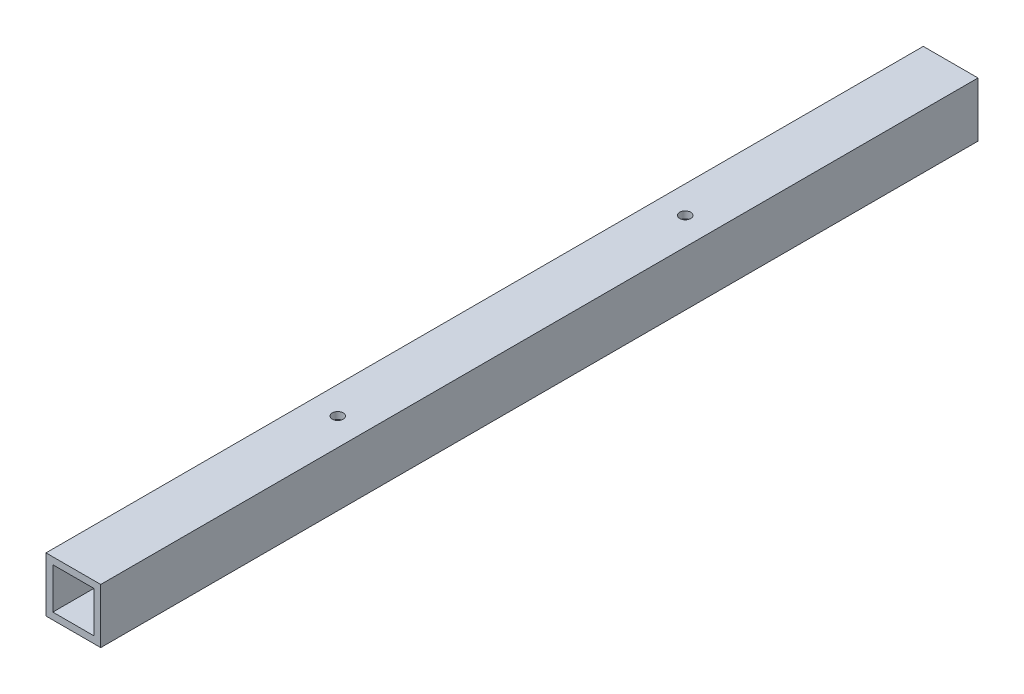
ISO-10303-21;
HEADER;
FILE_DESCRIPTION(('STEP AP214'),'2;1');
FILE_NAME('part.step','',(''),(''),'','','');
FILE_SCHEMA(('AUTOMOTIVE_DESIGN { 1 0 10303 214 1 1 1 1 }'));
ENDSEC;
DATA;
#1=APPLICATION_CONTEXT('core data for automotive mechanical design processes');
#2=APPLICATION_PROTOCOL_DEFINITION('international standard','automotive_design',2000,#1);
#3=PRODUCT_CONTEXT('',#1,'mechanical');
#4=PRODUCT('Part','Part','',(#3));
#5=PRODUCT_RELATED_PRODUCT_CATEGORY('part','',(#4));
#6=PRODUCT_DEFINITION_FORMATION('','',#4);
#7=PRODUCT_DEFINITION_CONTEXT('part definition',#1,'design');
#8=PRODUCT_DEFINITION('design','',#6,#7);
#9=PRODUCT_DEFINITION_SHAPE('','',#8);
#10=(LENGTH_UNIT() NAMED_UNIT(*) SI_UNIT(.MILLI.,.METRE.));
#11=(NAMED_UNIT(*) PLANE_ANGLE_UNIT() SI_UNIT($,.RADIAN.));
#12=(NAMED_UNIT(*) SI_UNIT($,.STERADIAN.) SOLID_ANGLE_UNIT());
#13=UNCERTAINTY_MEASURE_WITH_UNIT(LENGTH_MEASURE(1.E-05),#10,'distance_accuracy_value','');
#14=(GEOMETRIC_REPRESENTATION_CONTEXT(3) GLOBAL_UNCERTAINTY_ASSIGNED_CONTEXT((#13)) GLOBAL_UNIT_ASSIGNED_CONTEXT((#10,
#11,#12)) REPRESENTATION_CONTEXT('',''));
#15=CARTESIAN_POINT('',(0.,0.,0.));
#16=DIRECTION('',(0.,0.,1.));
#17=DIRECTION('',(1.,0.,0.));
#18=AXIS2_PLACEMENT_3D('',#15,#16,#17);
#19=CARTESIAN_POINT('',(-12.7,-12.7,407.19375));
#20=DIRECTION('',(0.,1.,0.));
#21=DIRECTION('',(0.,0.,1.));
#22=AXIS2_PLACEMENT_3D('',#19,#20,#21);
#23=PLANE('',#22);
#24=CARTESIAN_POINT('',(1.44190215323192E-10,-12.7,284.479999999999));
#25=DIRECTION('',(0.,1.,0.));
#26=DIRECTION('',(0.,0.,1.));
#27=AXIS2_PLACEMENT_3D('',#24,#25,#26);
#28=CIRCLE('',#27,7.62000000000002);
#29=CARTESIAN_POINT('',(1.44190215323192E-10,-12.7,276.859999999999));
#30=VERTEX_POINT('',#29);
#31=EDGE_CURVE('E249',#30,#30,#28,.T.);
#32=ORIENTED_EDGE('',*,*,#31,.T.);
#33=EDGE_LOOP('',(#32));
#34=FACE_BOUND('',#33,.T.);
#35=DIRECTION('',(1.,0.,0.));
#36=VECTOR('',#35,1.);
#37=CARTESIAN_POINT('',(-12.7,-12.7,0.));
#38=LINE('',#37,#36);
#39=CARTESIAN_POINT('',(-12.7,-12.7,0.));
#40=VERTEX_POINT('',#39);
#41=CARTESIAN_POINT('',(12.7,-12.7,0.));
#42=VERTEX_POINT('',#41);
#43=EDGE_CURVE('E145',#40,#42,#38,.T.);
#44=ORIENTED_EDGE('',*,*,#43,.T.);
#45=DIRECTION('',(0.,0.,-1.));
#46=VECTOR('',#45,1.);
#47=CARTESIAN_POINT('',(12.7,-12.7,407.19375));
#48=LINE('',#47,#46);
#49=CARTESIAN_POINT('',(12.7,-12.7,407.19375));
#50=VERTEX_POINT('',#49);
#51=EDGE_CURVE('E151',#50,#42,#48,.T.);
#52=ORIENTED_EDGE('',*,*,#51,.F.);
#53=DIRECTION('',(1.,0.,0.));
#54=VECTOR('',#53,1.);
#55=CARTESIAN_POINT('',(-12.7,-12.7,407.19375));
#56=LINE('',#55,#54);
#57=CARTESIAN_POINT('',(-12.7,-12.7,407.19375));
#58=VERTEX_POINT('',#57);
#59=EDGE_CURVE('E149',#58,#50,#56,.T.);
#60=ORIENTED_EDGE('',*,*,#59,.F.);
#61=DIRECTION('',(0.,0.,-1.));
#62=VECTOR('',#61,1.);
#63=CARTESIAN_POINT('',(-12.7,-12.7,407.19375));
#64=LINE('',#63,#62);
#65=EDGE_CURVE('E161',#58,#40,#64,.T.);
#66=ORIENTED_EDGE('',*,*,#65,.T.);
#67=EDGE_LOOP('',(#44,#52,#60,#66));
#68=FACE_BOUND('',#67,.T.);
#69=CARTESIAN_POINT('',(1.40221168010157E-10,-12.7,123.189999999998));
#70=DIRECTION('',(0.,1.,0.));
#71=DIRECTION('',(0.,0.,1.));
#72=AXIS2_PLACEMENT_3D('',#69,#70,#71);
#73=CIRCLE('',#72,7.62);
#74=CARTESIAN_POINT('',(1.40221168010157E-10,-12.7,115.569999999998));
#75=VERTEX_POINT('',#74);
#76=EDGE_CURVE('E243',#75,#75,#73,.T.);
#77=ORIENTED_EDGE('',*,*,#76,.T.);
#78=EDGE_LOOP('',(#77));
#79=FACE_BOUND('',#78,.T.);
#80=ADVANCED_FACE('F37',(#34,#68,#79),#23,.F.);
#81=CARTESIAN_POINT('',(-9.52500000000001,-9.52500000000001,407.19375));
#82=DIRECTION('',(0.,1.,0.));
#83=DIRECTION('',(0.,0.,1.));
#84=AXIS2_PLACEMENT_3D('',#81,#82,#83);
#85=PLANE('',#84);
#86=CARTESIAN_POINT('',(1.44190215323192E-10,-9.525,284.479999999999));
#87=DIRECTION('',(0.,1.,0.));
#88=DIRECTION('',(0.,0.,1.));
#89=AXIS2_PLACEMENT_3D('',#86,#87,#88);
#90=CIRCLE('',#89,7.62000000000002);
#91=CARTESIAN_POINT('',(1.44190215323192E-10,-9.52500000000001,276.859999999999));
#92=VERTEX_POINT('',#91);
#93=EDGE_CURVE('E244',#92,#92,#90,.T.);
#94=ORIENTED_EDGE('',*,*,#93,.F.);
#95=EDGE_LOOP('',(#94));
#96=FACE_BOUND('',#95,.T.);
#97=DIRECTION('',(1.,0.,0.));
#98=VECTOR('',#97,1.);
#99=CARTESIAN_POINT('',(-9.52500000000001,-9.52500000000001,0.));
#100=LINE('',#99,#98);
#101=CARTESIAN_POINT('',(-9.52500000000001,-9.52500000000001,0.));
#102=VERTEX_POINT('',#101);
#103=CARTESIAN_POINT('',(9.525,-9.52500000000001,0.));
#104=VERTEX_POINT('',#103);
#105=EDGE_CURVE('E111',#102,#104,#100,.T.);
#106=ORIENTED_EDGE('',*,*,#105,.F.);
#107=DIRECTION('',(0.,0.,-1.));
#108=VECTOR('',#107,1.);
#109=CARTESIAN_POINT('',(-9.52500000000001,-9.52500000000001,407.19375));
#110=LINE('',#109,#108);
#111=CARTESIAN_POINT('',(-9.52500000000001,-9.52500000000001,407.19375));
#112=VERTEX_POINT('',#111);
#113=EDGE_CURVE('E52',#112,#102,#110,.T.);
#114=ORIENTED_EDGE('',*,*,#113,.F.);
#115=DIRECTION('',(1.,0.,0.));
#116=VECTOR('',#115,1.);
#117=CARTESIAN_POINT('',(-9.52500000000001,-9.52500000000001,407.19375));
#118=LINE('',#117,#116);
#119=CARTESIAN_POINT('',(9.525,-9.52500000000001,407.19375));
#120=VERTEX_POINT('',#119);
#121=EDGE_CURVE('E125',#112,#120,#118,.T.);
#122=ORIENTED_EDGE('',*,*,#121,.T.);
#123=DIRECTION('',(0.,0.,-1.));
#124=VECTOR('',#123,1.);
#125=CARTESIAN_POINT('',(9.525,-9.52500000000001,407.19375));
#126=LINE('',#125,#124);
#127=EDGE_CURVE('E106',#120,#104,#126,.T.);
#128=ORIENTED_EDGE('',*,*,#127,.T.);
#129=EDGE_LOOP('',(#106,#114,#122,#128));
#130=FACE_BOUND('',#129,.T.);
#131=CARTESIAN_POINT('',(1.40221168010157E-10,-9.525,123.189999999998));
#132=DIRECTION('',(0.,1.,0.));
#133=DIRECTION('',(0.,0.,1.));
#134=AXIS2_PLACEMENT_3D('',#131,#132,#133);
#135=CIRCLE('',#134,7.62);
#136=CARTESIAN_POINT('',(1.40221168010157E-10,-9.52500000000001,115.569999999998));
#137=VERTEX_POINT('',#136);
#138=EDGE_CURVE('E240',#137,#137,#135,.T.);
#139=ORIENTED_EDGE('',*,*,#138,.F.);
#140=EDGE_LOOP('',(#139));
#141=FACE_BOUND('',#140,.T.);
#142=ADVANCED_FACE('F197',(#96,#130,#141),#85,.T.);
#143=CARTESIAN_POINT('',(0.,0.,407.19375));
#144=DIRECTION('',(0.,0.,1.));
#145=DIRECTION('',(1.,0.,0.));
#146=AXIS2_PLACEMENT_3D('',#143,#144,#145);
#147=PLANE('',#146);
#148=DIRECTION('',(0.,1.,0.));
#149=VECTOR('',#148,1.);
#150=CARTESIAN_POINT('',(12.7,12.7,407.19375));
#151=LINE('',#150,#149);
#152=CARTESIAN_POINT('',(12.7,12.7,407.19375));
#153=VERTEX_POINT('',#152);
#154=EDGE_CURVE('E141',#50,#153,#151,.T.);
#155=ORIENTED_EDGE('',*,*,#154,.T.);
#156=DIRECTION('',(-1.,0.,0.));
#157=VECTOR('',#156,1.);
#158=CARTESIAN_POINT('',(-12.7,12.7,407.19375));
#159=LINE('',#158,#157);
#160=CARTESIAN_POINT('',(-12.7,12.7,407.19375));
#161=VERTEX_POINT('',#160);
#162=EDGE_CURVE('E144',#153,#161,#159,.T.);
#163=ORIENTED_EDGE('',*,*,#162,.T.);
#164=DIRECTION('',(0.,-1.,0.));
#165=VECTOR('',#164,1.);
#166=CARTESIAN_POINT('',(-12.7,12.7,407.19375));
#167=LINE('',#166,#165);
#168=EDGE_CURVE('E147',#161,#58,#167,.T.);
#169=ORIENTED_EDGE('',*,*,#168,.T.);
#170=ORIENTED_EDGE('',*,*,#59,.T.);
#171=EDGE_LOOP('',(#155,#163,#169,#170));
#172=FACE_BOUND('',#171,.T.);
#173=DIRECTION('',(-1.,0.,0.));
#174=VECTOR('',#173,1.);
#175=CARTESIAN_POINT('',(-9.52500000000001,9.525,407.19375));
#176=LINE('',#175,#174);
#177=CARTESIAN_POINT('',(9.525,9.525,407.19375));
#178=VERTEX_POINT('',#177);
#179=CARTESIAN_POINT('',(-9.52500000000001,9.525,407.19375));
#180=VERTEX_POINT('',#179);
#181=EDGE_CURVE('E110',#178,#180,#176,.T.);
#182=ORIENTED_EDGE('',*,*,#181,.F.);
#183=DIRECTION('',(0.,1.,0.));
#184=VECTOR('',#183,1.);
#185=CARTESIAN_POINT('',(9.525,9.525,407.19375));
#186=LINE('',#185,#184);
#187=EDGE_CURVE('E102',#120,#178,#186,.T.);
#188=ORIENTED_EDGE('',*,*,#187,.F.);
#189=ORIENTED_EDGE('',*,*,#121,.F.);
#190=DIRECTION('',(0.,-1.,0.));
#191=VECTOR('',#190,1.);
#192=CARTESIAN_POINT('',(-9.52500000000001,9.525,407.19375));
#193=LINE('',#192,#191);
#194=EDGE_CURVE('E123',#180,#112,#193,.T.);
#195=ORIENTED_EDGE('',*,*,#194,.F.);
#196=EDGE_LOOP('',(#182,#188,#189,#195));
#197=FACE_BOUND('',#196,.T.);
#198=ADVANCED_FACE('F122',(#172,#197),#147,.T.);
#199=CARTESIAN_POINT('',(0.,0.,0.));
#200=DIRECTION('',(0.,0.,1.));
#201=DIRECTION('',(1.,0.,0.));
#202=AXIS2_PLACEMENT_3D('',#199,#200,#201);
#203=PLANE('',#202);
#204=DIRECTION('',(0.,1.,0.));
#205=VECTOR('',#204,1.);
#206=CARTESIAN_POINT('',(12.7,12.7,0.));
#207=LINE('',#206,#205);
#208=CARTESIAN_POINT('',(12.7,12.7,0.));
#209=VERTEX_POINT('',#208);
#210=EDGE_CURVE('E118',#42,#209,#207,.T.);
#211=ORIENTED_EDGE('',*,*,#210,.F.);
#212=ORIENTED_EDGE('',*,*,#43,.F.);
#213=DIRECTION('',(0.,-1.,0.));
#214=VECTOR('',#213,1.);
#215=CARTESIAN_POINT('',(-12.7,12.7,0.));
#216=LINE('',#215,#214);
#217=CARTESIAN_POINT('',(-12.7,12.7,0.));
#218=VERTEX_POINT('',#217);
#219=EDGE_CURVE('E156',#218,#40,#216,.T.);
#220=ORIENTED_EDGE('',*,*,#219,.F.);
#221=DIRECTION('',(-1.,0.,0.));
#222=VECTOR('',#221,1.);
#223=CARTESIAN_POINT('',(-12.7,12.7,0.));
#224=LINE('',#223,#222);
#225=EDGE_CURVE('E154',#209,#218,#224,.T.);
#226=ORIENTED_EDGE('',*,*,#225,.F.);
#227=EDGE_LOOP('',(#211,#212,#220,#226));
#228=FACE_BOUND('',#227,.T.);
#229=DIRECTION('',(0.,1.,0.));
#230=VECTOR('',#229,1.);
#231=CARTESIAN_POINT('',(9.525,9.525,0.));
#232=LINE('',#231,#230);
#233=CARTESIAN_POINT('',(9.525,9.525,0.));
#234=VERTEX_POINT('',#233);
#235=EDGE_CURVE('E60',#104,#234,#232,.T.);
#236=ORIENTED_EDGE('',*,*,#235,.T.);
#237=DIRECTION('',(-1.,0.,0.));
#238=VECTOR('',#237,1.);
#239=CARTESIAN_POINT('',(-9.52500000000001,9.525,0.));
#240=LINE('',#239,#238);
#241=CARTESIAN_POINT('',(-9.52500000000001,9.525,0.));
#242=VERTEX_POINT('',#241);
#243=EDGE_CURVE('E117',#234,#242,#240,.T.);
#244=ORIENTED_EDGE('',*,*,#243,.T.);
#245=DIRECTION('',(0.,-1.,0.));
#246=VECTOR('',#245,1.);
#247=CARTESIAN_POINT('',(-9.52500000000001,9.525,0.));
#248=LINE('',#247,#246);
#249=EDGE_CURVE('E133',#242,#102,#248,.T.);
#250=ORIENTED_EDGE('',*,*,#249,.T.);
#251=ORIENTED_EDGE('',*,*,#105,.T.);
#252=EDGE_LOOP('',(#236,#244,#250,#251));
#253=FACE_BOUND('',#252,.T.);
#254=ADVANCED_FACE('F174',(#228,#253),#203,.F.);
#255=CARTESIAN_POINT('',(12.7,12.7,407.19375));
#256=DIRECTION('',(-1.,0.,0.));
#257=DIRECTION('',(0.,-1.,0.));
#258=AXIS2_PLACEMENT_3D('',#255,#256,#257);
#259=PLANE('',#258);
#260=ORIENTED_EDGE('',*,*,#210,.T.);
#261=DIRECTION('',(0.,0.,-1.));
#262=VECTOR('',#261,1.);
#263=CARTESIAN_POINT('',(12.7,12.7,407.19375));
#264=LINE('',#263,#262);
#265=EDGE_CURVE('E11',#153,#209,#264,.T.);
#266=ORIENTED_EDGE('',*,*,#265,.F.);
#267=ORIENTED_EDGE('',*,*,#154,.F.);
#268=ORIENTED_EDGE('',*,*,#51,.T.);
#269=EDGE_LOOP('',(#260,#266,#267,#268));
#270=FACE_BOUND('',#269,.T.);
#271=ADVANCED_FACE('F39',(#270),#259,.F.);
#272=CARTESIAN_POINT('',(-12.7,12.7,407.19375));
#273=DIRECTION('',(0.,-1.,0.));
#274=DIRECTION('',(1.,0.,0.));
#275=AXIS2_PLACEMENT_3D('',#272,#273,#274);
#276=PLANE('',#275);
#277=CARTESIAN_POINT('',(1.40221168010157E-10,12.699999999994,123.189999999998));
#278=DIRECTION('',(0.,1.,0.));
#279=DIRECTION('',(0.,0.,1.));
#280=AXIS2_PLACEMENT_3D('',#277,#278,#279);
#281=CIRCLE('',#280,2.55269999999999);
#282=CARTESIAN_POINT('',(1.40221168010157E-10,12.699999999994,125.742699999998));
#283=VERTEX_POINT('',#282);
#284=EDGE_CURVE('E246',#283,#283,#281,.T.);
#285=ORIENTED_EDGE('',*,*,#284,.F.);
#286=EDGE_LOOP('',(#285));
#287=FACE_BOUND('',#286,.T.);
#288=CARTESIAN_POINT('',(1.44190215323192E-10,12.699999999994,284.479999999999));
#289=DIRECTION('',(0.,1.,0.));
#290=DIRECTION('',(0.,0.,1.));
#291=AXIS2_PLACEMENT_3D('',#288,#289,#290);
#292=CIRCLE('',#291,2.55269999999999);
#293=CARTESIAN_POINT('',(1.44190215323192E-10,12.699999999994,287.032699999999));
#294=VERTEX_POINT('',#293);
#295=EDGE_CURVE('E258',#294,#294,#292,.T.);
#296=ORIENTED_EDGE('',*,*,#295,.F.);
#297=EDGE_LOOP('',(#296));
#298=FACE_BOUND('',#297,.T.);
#299=ORIENTED_EDGE('',*,*,#225,.T.);
#300=DIRECTION('',(0.,0.,-1.));
#301=VECTOR('',#300,1.);
#302=CARTESIAN_POINT('',(-12.7,12.7,407.19375));
#303=LINE('',#302,#301);
#304=EDGE_CURVE('E45',#161,#218,#303,.T.);
#305=ORIENTED_EDGE('',*,*,#304,.F.);
#306=ORIENTED_EDGE('',*,*,#162,.F.);
#307=ORIENTED_EDGE('',*,*,#265,.T.);
#308=EDGE_LOOP('',(#299,#305,#306,#307));
#309=FACE_BOUND('',#308,.T.);
#310=ADVANCED_FACE('F184',(#287,#298,#309),#276,.F.);
#311=CARTESIAN_POINT('',(-12.7,12.7,407.19375));
#312=DIRECTION('',(1.,0.,0.));
#313=DIRECTION('',(0.,0.,-1.));
#314=AXIS2_PLACEMENT_3D('',#311,#312,#313);
#315=PLANE('',#314);
#316=ORIENTED_EDGE('',*,*,#219,.T.);
#317=ORIENTED_EDGE('',*,*,#65,.F.);
#318=ORIENTED_EDGE('',*,*,#168,.F.);
#319=ORIENTED_EDGE('',*,*,#304,.T.);
#320=EDGE_LOOP('',(#316,#317,#318,#319));
#321=FACE_BOUND('',#320,.T.);
#322=ADVANCED_FACE('F168',(#321),#315,.F.);
#323=CARTESIAN_POINT('',(9.525,9.525,407.19375));
#324=DIRECTION('',(-1.,0.,0.));
#325=DIRECTION('',(0.,0.,1.));
#326=AXIS2_PLACEMENT_3D('',#323,#324,#325);
#327=PLANE('',#326);
#328=ORIENTED_EDGE('',*,*,#235,.F.);
#329=ORIENTED_EDGE('',*,*,#127,.F.);
#330=ORIENTED_EDGE('',*,*,#187,.T.);
#331=DIRECTION('',(0.,0.,-1.));
#332=VECTOR('',#331,1.);
#333=CARTESIAN_POINT('',(9.525,9.525,407.19375));
#334=LINE('',#333,#332);
#335=EDGE_CURVE('E105',#178,#234,#334,.T.);
#336=ORIENTED_EDGE('',*,*,#335,.T.);
#337=EDGE_LOOP('',(#328,#329,#330,#336));
#338=FACE_BOUND('',#337,.T.);
#339=ADVANCED_FACE('F104',(#338),#327,.T.);
#340=CARTESIAN_POINT('',(-9.52500000000001,9.525,407.19375));
#341=DIRECTION('',(0.,-1.,0.));
#342=DIRECTION('',(0.,0.,-1.));
#343=AXIS2_PLACEMENT_3D('',#340,#341,#342);
#344=PLANE('',#343);
#345=CARTESIAN_POINT('',(1.40221168010157E-10,9.525,123.189999999998));
#346=DIRECTION('',(0.,-1.,0.));
#347=DIRECTION('',(0.,0.,-1.));
#348=AXIS2_PLACEMENT_3D('',#345,#346,#347);
#349=CIRCLE('',#348,2.55269999999999);
#350=CARTESIAN_POINT('',(1.40221168010157E-10,9.525,120.637299999998));
#351=VERTEX_POINT('',#350);
#352=EDGE_CURVE('E255',#351,#351,#349,.T.);
#353=ORIENTED_EDGE('',*,*,#352,.F.);
#354=EDGE_LOOP('',(#353));
#355=FACE_BOUND('',#354,.T.);
#356=CARTESIAN_POINT('',(1.44190215323192E-10,9.525,284.479999999999));
#357=DIRECTION('',(0.,-1.,0.));
#358=DIRECTION('',(0.,0.,-1.));
#359=AXIS2_PLACEMENT_3D('',#356,#357,#358);
#360=CIRCLE('',#359,2.55269999999999);
#361=CARTESIAN_POINT('',(1.44190215323192E-10,9.525,281.927299999999));
#362=VERTEX_POINT('',#361);
#363=EDGE_CURVE('E131',#362,#362,#360,.T.);
#364=ORIENTED_EDGE('',*,*,#363,.F.);
#365=EDGE_LOOP('',(#364));
#366=FACE_BOUND('',#365,.T.);
#367=ORIENTED_EDGE('',*,*,#243,.F.);
#368=ORIENTED_EDGE('',*,*,#335,.F.);
#369=ORIENTED_EDGE('',*,*,#181,.T.);
#370=DIRECTION('',(0.,0.,-1.));
#371=VECTOR('',#370,1.);
#372=CARTESIAN_POINT('',(-9.52500000000001,9.525,407.19375));
#373=LINE('',#372,#371);
#374=EDGE_CURVE('E119',#180,#242,#373,.T.);
#375=ORIENTED_EDGE('',*,*,#374,.T.);
#376=EDGE_LOOP('',(#367,#368,#369,#375));
#377=FACE_BOUND('',#376,.T.);
#378=ADVANCED_FACE('F114',(#355,#366,#377),#344,.T.);
#379=CARTESIAN_POINT('',(-9.52500000000001,9.525,407.19375));
#380=DIRECTION('',(1.,0.,0.));
#381=DIRECTION('',(0.,0.,-1.));
#382=AXIS2_PLACEMENT_3D('',#379,#380,#381);
#383=PLANE('',#382);
#384=ORIENTED_EDGE('',*,*,#249,.F.);
#385=ORIENTED_EDGE('',*,*,#374,.F.);
#386=ORIENTED_EDGE('',*,*,#194,.T.);
#387=ORIENTED_EDGE('',*,*,#113,.T.);
#388=EDGE_LOOP('',(#384,#385,#386,#387));
#389=FACE_BOUND('',#388,.T.);
#390=ADVANCED_FACE('F215',(#389),#383,.T.);
#391=CARTESIAN_POINT('',(1.44190215323192E-10,12.699999999994,284.479999999999));
#392=DIRECTION('',(0.,1.,0.));
#393=DIRECTION('',(0.,0.,1.));
#394=AXIS2_PLACEMENT_3D('',#391,#392,#393);
#395=CYLINDRICAL_SURFACE('',#394,2.55269999999999);
#396=ORIENTED_EDGE('',*,*,#363,.T.);
#397=EDGE_LOOP('',(#396));
#398=FACE_BOUND('',#397,.T.);
#399=ORIENTED_EDGE('',*,*,#295,.T.);
#400=EDGE_LOOP('',(#399));
#401=FACE_BOUND('',#400,.T.);
#402=ADVANCED_FACE('F218',(#398,#401),#395,.F.);
#403=CARTESIAN_POINT('',(1.40221168010157E-10,12.699999999994,123.189999999998));
#404=DIRECTION('',(0.,1.,0.));
#405=DIRECTION('',(0.,0.,1.));
#406=AXIS2_PLACEMENT_3D('',#403,#404,#405);
#407=CYLINDRICAL_SURFACE('',#406,2.55269999999999);
#408=ORIENTED_EDGE('',*,*,#352,.T.);
#409=EDGE_LOOP('',(#408));
#410=FACE_BOUND('',#409,.T.);
#411=ORIENTED_EDGE('',*,*,#284,.T.);
#412=EDGE_LOOP('',(#411));
#413=FACE_BOUND('',#412,.T.);
#414=ADVANCED_FACE('F223',(#410,#413),#407,.F.);
#415=CARTESIAN_POINT('',(1.44190215323192E-10,12.701,284.479999999999));
#416=DIRECTION('',(0.,-1.,0.));
#417=DIRECTION('',(0.,0.,-1.));
#418=AXIS2_PLACEMENT_3D('',#415,#416,#417);
#419=CYLINDRICAL_SURFACE('',#418,7.62000000000002);
#420=CARTESIAN_POINT('',(1.44190215323192E-10,-9.52500000000001,276.859999999999));
#421=CARTESIAN_POINT('',(1.44190215323192E-10,-9.55807291666667,276.859999999999));
#422=CARTESIAN_POINT('',(1.44190215323192E-10,-9.59114583333334,276.859999999999));
#423=CARTESIAN_POINT('',(1.44190215323192E-10,-9.65729166666667,276.859999999999));
#424=CARTESIAN_POINT('',(1.44190215323192E-10,-9.69036458333334,276.859999999999));
#425=CARTESIAN_POINT('',(1.44190215323192E-10,-9.75651041666667,276.859999999999));
#426=CARTESIAN_POINT('',(1.44190215323192E-10,-9.78958333333334,276.859999999999));
#427=CARTESIAN_POINT('',(1.44190215323192E-10,-9.85572916666667,276.859999999999));
#428=CARTESIAN_POINT('',(1.44190215323192E-10,-9.88880208333334,276.859999999999));
#429=CARTESIAN_POINT('',(1.44190215323192E-10,-9.95494791666667,276.859999999999));
#430=CARTESIAN_POINT('',(1.44190215323192E-10,-9.98802083333334,276.859999999999));
#431=CARTESIAN_POINT('',(1.44190215323192E-10,-10.0541666666667,276.859999999999));
#432=CARTESIAN_POINT('',(1.44190215323192E-10,-10.0872395833333,276.859999999999));
#433=CARTESIAN_POINT('',(1.44190215323192E-10,-10.1533854166667,276.859999999999));
#434=CARTESIAN_POINT('',(1.44190215323192E-10,-10.1864583333333,276.859999999999));
#435=CARTESIAN_POINT('',(1.44190215323192E-10,-10.2526041666667,276.859999999999));
#436=CARTESIAN_POINT('',(1.44190215323192E-10,-10.2856770833333,276.859999999999));
#437=CARTESIAN_POINT('',(1.44190215323192E-10,-10.3518229166667,276.859999999999));
#438=CARTESIAN_POINT('',(1.44190215323192E-10,-10.3848958333333,276.859999999999));
#439=CARTESIAN_POINT('',(1.44190215323192E-10,-10.4510416666667,276.859999999999));
#440=CARTESIAN_POINT('',(1.44190215323192E-10,-10.4841145833333,276.859999999999));
#441=CARTESIAN_POINT('',(1.44190215323192E-10,-10.5502604166667,276.859999999999));
#442=CARTESIAN_POINT('',(1.44190215323192E-10,-10.5833333333333,276.859999999999));
#443=CARTESIAN_POINT('',(1.44190215323192E-10,-10.6494791666667,276.859999999999));
#444=CARTESIAN_POINT('',(1.44190215323192E-10,-10.6825520833333,276.859999999999));
#445=CARTESIAN_POINT('',(1.44190215323192E-10,-10.7486979166667,276.859999999999));
#446=CARTESIAN_POINT('',(1.44190215323192E-10,-10.7817708333333,276.859999999999));
#447=CARTESIAN_POINT('',(1.44190215323192E-10,-10.8479166666667,276.859999999999));
#448=CARTESIAN_POINT('',(1.44190215323192E-10,-10.8809895833333,276.859999999999));
#449=CARTESIAN_POINT('',(1.44190215323192E-10,-10.9471354166667,276.859999999999));
#450=CARTESIAN_POINT('',(1.44190215323192E-10,-10.9802083333333,276.859999999999));
#451=CARTESIAN_POINT('',(1.44190215323192E-10,-11.0463541666667,276.859999999999));
#452=CARTESIAN_POINT('',(1.44190215323192E-10,-11.0794270833333,276.859999999999));
#453=CARTESIAN_POINT('',(1.44190215323192E-10,-11.1455729166667,276.859999999999));
#454=CARTESIAN_POINT('',(1.44190215323192E-10,-11.1786458333333,276.859999999999));
#455=CARTESIAN_POINT('',(1.44190215323192E-10,-11.2447916666667,276.859999999999));
#456=CARTESIAN_POINT('',(1.44190215323192E-10,-11.2778645833333,276.859999999999));
#457=CARTESIAN_POINT('',(1.44190215323192E-10,-11.3440104166667,276.859999999999));
#458=CARTESIAN_POINT('',(1.44190215323192E-10,-11.3770833333333,276.859999999999));
#459=CARTESIAN_POINT('',(1.44190215323192E-10,-11.4432291666667,276.859999999999));
#460=CARTESIAN_POINT('',(1.44190215323192E-10,-11.4763020833333,276.859999999999));
#461=CARTESIAN_POINT('',(1.44190215323192E-10,-11.5424479166667,276.859999999999));
#462=CARTESIAN_POINT('',(1.44190215323192E-10,-11.5755208333333,276.859999999999));
#463=CARTESIAN_POINT('',(1.44190215323192E-10,-11.6416666666667,276.859999999999));
#464=CARTESIAN_POINT('',(1.44190215323192E-10,-11.6747395833333,276.859999999999));
#465=CARTESIAN_POINT('',(1.44190215323192E-10,-11.7408854166667,276.859999999999));
#466=CARTESIAN_POINT('',(1.44190215323192E-10,-11.7739583333333,276.859999999999));
#467=CARTESIAN_POINT('',(1.44190215323192E-10,-11.8401041666667,276.859999999999));
#468=CARTESIAN_POINT('',(1.44190215323192E-10,-11.8731770833333,276.859999999999));
#469=CARTESIAN_POINT('',(1.44190215323192E-10,-11.9393229166667,276.859999999999));
#470=CARTESIAN_POINT('',(1.44190215323192E-10,-11.9723958333333,276.859999999999));
#471=CARTESIAN_POINT('',(1.44190215323192E-10,-12.0385416666667,276.859999999999));
#472=CARTESIAN_POINT('',(1.44190215323192E-10,-12.0716145833333,276.859999999999));
#473=CARTESIAN_POINT('',(1.44190215323192E-10,-12.1377604166667,276.859999999999));
#474=CARTESIAN_POINT('',(1.44190215323192E-10,-12.1708333333333,276.859999999999));
#475=CARTESIAN_POINT('',(1.44190215323192E-10,-12.2369791666667,276.859999999999));
#476=CARTESIAN_POINT('',(1.44190215323192E-10,-12.2700520833333,276.859999999999));
#477=CARTESIAN_POINT('',(1.44190215323192E-10,-12.3361979166667,276.859999999999));
#478=CARTESIAN_POINT('',(1.44190215323192E-10,-12.3692708333333,276.859999999999));
#479=CARTESIAN_POINT('',(1.44190215323192E-10,-12.4354166666667,276.859999999999));
#480=CARTESIAN_POINT('',(1.44190215323192E-10,-12.4684895833333,276.859999999999));
#481=CARTESIAN_POINT('',(1.44190215323192E-10,-12.5346354166667,276.859999999999));
#482=CARTESIAN_POINT('',(1.44190215323192E-10,-12.5677083333333,276.859999999999));
#483=CARTESIAN_POINT('',(1.44190215323192E-10,-12.6338541666667,276.859999999999));
#484=CARTESIAN_POINT('',(1.44190215323192E-10,-12.6669270833333,276.859999999999));
#485=CARTESIAN_POINT('',(1.44190215323192E-10,-12.7,276.859999999999));
#486=B_SPLINE_CURVE_WITH_KNOTS('',3,(#420,#421,#422,#423,#424,#425,#426,#427,#428,#429,#430,
#431,#432,#433,#434,#435,#436,#437,#438,#439,#440,#441,#442,#443,#444,#445,#446,#447,#448,#449,
#450,#451,#452,#453,#454,#455,#456,#457,#458,#459,#460,#461,#462,#463,#464,#465,#466,#467,#468,
#469,#470,#471,#472,#473,#474,#475,#476,#477,#478,#479,#480,#481,#482,#483,#484,#485),
.UNSPECIFIED.,.F.,.F.,(4,2,2,2,2,2,2,2,2,2,2,2,2,2,2,2,2,2,2,2,2,2,2,2,2,2,2,2,2,2,2,2,4),(0.,
0.0992187500000012,0.198437499999999,0.29765625,0.396874999999998,0.496093749999999,0.5953125,
0.694531249999998,0.793749999999999,0.892968750000001,0.992187499999998,1.09140625,1.190625,
1.28984375,1.3890625,1.48828125,1.5875,1.68671875,1.7859375,1.88515625,1.984375,2.08359375,
2.1828125,2.28203125,2.38125,2.48046875,2.5796875,2.67890625,2.778125,2.87734375,2.9765625,
3.07578125,3.175),.UNSPECIFIED.);
#487=EDGE_CURVE('BSEAM227',#92,#30,#486,.T.);
#488=ORIENTED_EDGE('',*,*,#93,.T.);
#489=ORIENTED_EDGE('',*,*,#31,.F.);
#490=ORIENTED_EDGE('',*,*,#487,.T.);
#491=ORIENTED_EDGE('',*,*,#487,.F.);
#492=EDGE_LOOP('',(#488,#490,#489,#491));
#493=FACE_BOUND('',#492,.T.);
#494=ADVANCED_FACE('F227',(#493),#419,.F.);
#495=CARTESIAN_POINT('',(1.40221168010157E-10,12.701,123.189999999998));
#496=DIRECTION('',(0.,-1.,0.));
#497=DIRECTION('',(0.,0.,-1.));
#498=AXIS2_PLACEMENT_3D('',#495,#496,#497);
#499=CYLINDRICAL_SURFACE('',#498,7.62);
#500=CARTESIAN_POINT('',(1.40221168010157E-10,-9.52500000000001,115.569999999998));
#501=CARTESIAN_POINT('',(1.40221168010157E-10,-9.55807291666667,115.569999999998));
#502=CARTESIAN_POINT('',(1.40221168010157E-10,-9.59114583333334,115.569999999998));
#503=CARTESIAN_POINT('',(1.40221168010157E-10,-9.65729166666667,115.569999999998));
#504=CARTESIAN_POINT('',(1.40221168010157E-10,-9.69036458333334,115.569999999998));
#505=CARTESIAN_POINT('',(1.40221168010157E-10,-9.75651041666667,115.569999999998));
#506=CARTESIAN_POINT('',(1.40221168010157E-10,-9.78958333333334,115.569999999998));
#507=CARTESIAN_POINT('',(1.40221168010157E-10,-9.85572916666667,115.569999999998));
#508=CARTESIAN_POINT('',(1.40221168010157E-10,-9.88880208333334,115.569999999998));
#509=CARTESIAN_POINT('',(1.40221168010157E-10,-9.95494791666667,115.569999999998));
#510=CARTESIAN_POINT('',(1.40221168010157E-10,-9.98802083333334,115.569999999998));
#511=CARTESIAN_POINT('',(1.40221168010157E-10,-10.0541666666667,115.569999999998));
#512=CARTESIAN_POINT('',(1.40221168010157E-10,-10.0872395833333,115.569999999998));
#513=CARTESIAN_POINT('',(1.40221168010157E-10,-10.1533854166667,115.569999999998));
#514=CARTESIAN_POINT('',(1.40221168010157E-10,-10.1864583333333,115.569999999998));
#515=CARTESIAN_POINT('',(1.40221168010157E-10,-10.2526041666667,115.569999999998));
#516=CARTESIAN_POINT('',(1.40221168010157E-10,-10.2856770833333,115.569999999998));
#517=CARTESIAN_POINT('',(1.40221168010157E-10,-10.3518229166667,115.569999999998));
#518=CARTESIAN_POINT('',(1.40221168010157E-10,-10.3848958333333,115.569999999998));
#519=CARTESIAN_POINT('',(1.40221168010157E-10,-10.4510416666667,115.569999999998));
#520=CARTESIAN_POINT('',(1.40221168010157E-10,-10.4841145833333,115.569999999998));
#521=CARTESIAN_POINT('',(1.40221168010157E-10,-10.5502604166667,115.569999999998));
#522=CARTESIAN_POINT('',(1.40221168010157E-10,-10.5833333333333,115.569999999998));
#523=CARTESIAN_POINT('',(1.40221168010157E-10,-10.6494791666667,115.569999999998));
#524=CARTESIAN_POINT('',(1.40221168010157E-10,-10.6825520833333,115.569999999998));
#525=CARTESIAN_POINT('',(1.40221168010157E-10,-10.7486979166667,115.569999999998));
#526=CARTESIAN_POINT('',(1.40221168010157E-10,-10.7817708333333,115.569999999998));
#527=CARTESIAN_POINT('',(1.40221168010157E-10,-10.8479166666667,115.569999999998));
#528=CARTESIAN_POINT('',(1.40221168010157E-10,-10.8809895833333,115.569999999998));
#529=CARTESIAN_POINT('',(1.40221168010157E-10,-10.9471354166667,115.569999999998));
#530=CARTESIAN_POINT('',(1.40221168010157E-10,-10.9802083333333,115.569999999998));
#531=CARTESIAN_POINT('',(1.40221168010157E-10,-11.0463541666667,115.569999999998));
#532=CARTESIAN_POINT('',(1.40221168010157E-10,-11.0794270833333,115.569999999998));
#533=CARTESIAN_POINT('',(1.40221168010157E-10,-11.1455729166667,115.569999999998));
#534=CARTESIAN_POINT('',(1.40221168010157E-10,-11.1786458333333,115.569999999998));
#535=CARTESIAN_POINT('',(1.40221168010157E-10,-11.2447916666667,115.569999999998));
#536=CARTESIAN_POINT('',(1.40221168010157E-10,-11.2778645833333,115.569999999998));
#537=CARTESIAN_POINT('',(1.40221168010157E-10,-11.3440104166667,115.569999999998));
#538=CARTESIAN_POINT('',(1.40221168010157E-10,-11.3770833333333,115.569999999998));
#539=CARTESIAN_POINT('',(1.40221168010157E-10,-11.4432291666667,115.569999999998));
#540=CARTESIAN_POINT('',(1.40221168010157E-10,-11.4763020833333,115.569999999998));
#541=CARTESIAN_POINT('',(1.40221168010157E-10,-11.5424479166667,115.569999999998));
#542=CARTESIAN_POINT('',(1.40221168010157E-10,-11.5755208333333,115.569999999998));
#543=CARTESIAN_POINT('',(1.40221168010157E-10,-11.6416666666667,115.569999999998));
#544=CARTESIAN_POINT('',(1.40221168010157E-10,-11.6747395833333,115.569999999998));
#545=CARTESIAN_POINT('',(1.40221168010157E-10,-11.7408854166667,115.569999999998));
#546=CARTESIAN_POINT('',(1.40221168010157E-10,-11.7739583333333,115.569999999998));
#547=CARTESIAN_POINT('',(1.40221168010157E-10,-11.8401041666667,115.569999999998));
#548=CARTESIAN_POINT('',(1.40221168010157E-10,-11.8731770833333,115.569999999998));
#549=CARTESIAN_POINT('',(1.40221168010157E-10,-11.9393229166667,115.569999999998));
#550=CARTESIAN_POINT('',(1.40221168010157E-10,-11.9723958333333,115.569999999998));
#551=CARTESIAN_POINT('',(1.40221168010157E-10,-12.0385416666667,115.569999999998));
#552=CARTESIAN_POINT('',(1.40221168010157E-10,-12.0716145833333,115.569999999998));
#553=CARTESIAN_POINT('',(1.40221168010157E-10,-12.1377604166667,115.569999999998));
#554=CARTESIAN_POINT('',(1.40221168010157E-10,-12.1708333333333,115.569999999998));
#555=CARTESIAN_POINT('',(1.40221168010157E-10,-12.2369791666667,115.569999999998));
#556=CARTESIAN_POINT('',(1.40221168010157E-10,-12.2700520833333,115.569999999998));
#557=CARTESIAN_POINT('',(1.40221168010157E-10,-12.3361979166667,115.569999999998));
#558=CARTESIAN_POINT('',(1.40221168010157E-10,-12.3692708333333,115.569999999998));
#559=CARTESIAN_POINT('',(1.40221168010157E-10,-12.4354166666667,115.569999999998));
#560=CARTESIAN_POINT('',(1.40221168010157E-10,-12.4684895833333,115.569999999998));
#561=CARTESIAN_POINT('',(1.40221168010157E-10,-12.5346354166667,115.569999999998));
#562=CARTESIAN_POINT('',(1.40221168010157E-10,-12.5677083333333,115.569999999998));
#563=CARTESIAN_POINT('',(1.40221168010157E-10,-12.6338541666667,115.569999999998));
#564=CARTESIAN_POINT('',(1.40221168010157E-10,-12.6669270833333,115.569999999998));
#565=CARTESIAN_POINT('',(1.40221168010157E-10,-12.7,115.569999999998));
#566=B_SPLINE_CURVE_WITH_KNOTS('',3,(#500,#501,#502,#503,#504,#505,#506,#507,#508,#509,#510,
#511,#512,#513,#514,#515,#516,#517,#518,#519,#520,#521,#522,#523,#524,#525,#526,#527,#528,#529,
#530,#531,#532,#533,#534,#535,#536,#537,#538,#539,#540,#541,#542,#543,#544,#545,#546,#547,#548,
#549,#550,#551,#552,#553,#554,#555,#556,#557,#558,#559,#560,#561,#562,#563,#564,#565),
.UNSPECIFIED.,.F.,.F.,(4,2,2,2,2,2,2,2,2,2,2,2,2,2,2,2,2,2,2,2,2,2,2,2,2,2,2,2,2,2,2,2,4),(0.,
0.0992187500000012,0.198437499999999,0.29765625,0.396874999999998,0.496093749999999,0.5953125,
0.694531249999998,0.793749999999999,0.892968750000001,0.992187499999998,1.09140625,1.190625,
1.28984375,1.3890625,1.48828125,1.5875,1.68671875,1.7859375,1.88515625,1.984375,2.08359375,
2.1828125,2.28203125,2.38125,2.48046875,2.5796875,2.67890625,2.778125,2.87734375,2.9765625,
3.07578125,3.175),.UNSPECIFIED.);
#567=EDGE_CURVE('BSEAM231',#137,#75,#566,.T.);
#568=ORIENTED_EDGE('',*,*,#138,.T.);
#569=ORIENTED_EDGE('',*,*,#76,.F.);
#570=ORIENTED_EDGE('',*,*,#567,.T.);
#571=ORIENTED_EDGE('',*,*,#567,.F.);
#572=EDGE_LOOP('',(#568,#570,#569,#571));
#573=FACE_BOUND('',#572,.T.);
#574=ADVANCED_FACE('F231',(#573),#499,.F.);
#575=CLOSED_SHELL('',(#80,#142,#198,#254,#271,#310,#322,#339,#378,#390,#402,#414,#494,#574));
#576=MANIFOLD_SOLID_BREP('B2',#575);
#577=ADVANCED_BREP_SHAPE_REPRESENTATION('',(#18,#576),#14);
#578=SHAPE_DEFINITION_REPRESENTATION(#9,#577);
ENDSEC;
END-ISO-10303-21;
